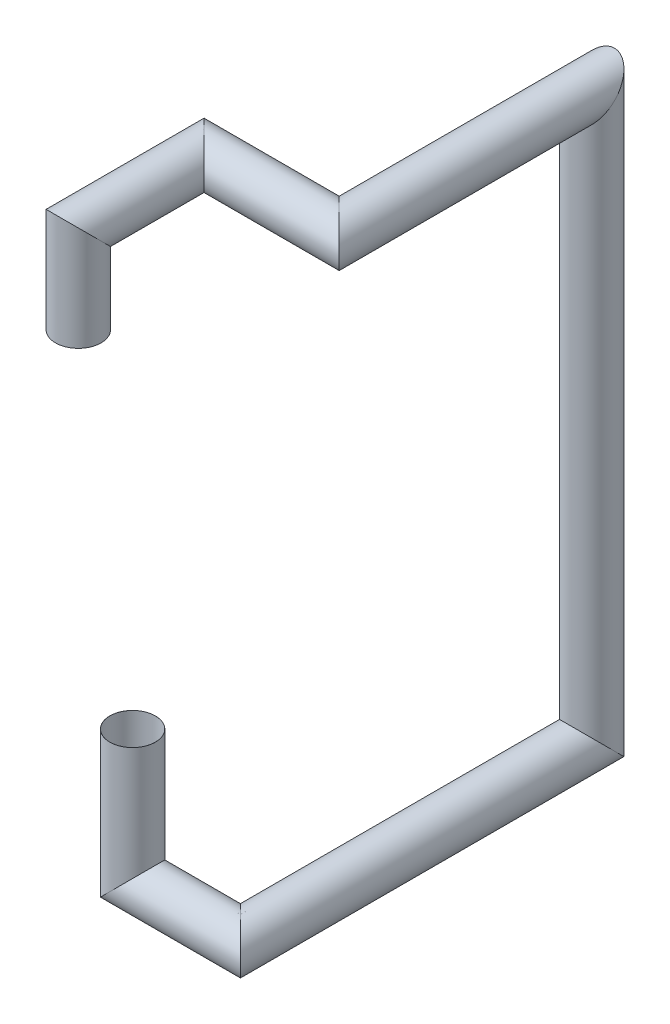
ISO-10303-21;
HEADER;
FILE_DESCRIPTION(('STEP AP214'),'2;1');
FILE_NAME('part.step','',(''),(''),'','','');
FILE_SCHEMA(('AUTOMOTIVE_DESIGN { 1 0 10303 214 1 1 1 1 }'));
ENDSEC;
DATA;
#1=APPLICATION_CONTEXT('core data for automotive mechanical design processes');
#2=APPLICATION_PROTOCOL_DEFINITION('international standard','automotive_design',2000,#1);
#3=PRODUCT_CONTEXT('',#1,'mechanical');
#4=PRODUCT('Part','Part','',(#3));
#5=PRODUCT_RELATED_PRODUCT_CATEGORY('part','',(#4));
#6=PRODUCT_DEFINITION_FORMATION('','',#4);
#7=PRODUCT_DEFINITION_CONTEXT('part definition',#1,'design');
#8=PRODUCT_DEFINITION('design','',#6,#7);
#9=PRODUCT_DEFINITION_SHAPE('','',#8);
#10=(LENGTH_UNIT() NAMED_UNIT(*) SI_UNIT(.MILLI.,.METRE.));
#11=(NAMED_UNIT(*) PLANE_ANGLE_UNIT() SI_UNIT($,.RADIAN.));
#12=(NAMED_UNIT(*) SI_UNIT($,.STERADIAN.) SOLID_ANGLE_UNIT());
#13=UNCERTAINTY_MEASURE_WITH_UNIT(LENGTH_MEASURE(1.E-05),#10,'distance_accuracy_value','');
#14=(GEOMETRIC_REPRESENTATION_CONTEXT(3) GLOBAL_UNCERTAINTY_ASSIGNED_CONTEXT((#13)) GLOBAL_UNIT_ASSIGNED_CONTEXT((#10,
#11,#12)) REPRESENTATION_CONTEXT('',''));
#15=CARTESIAN_POINT('',(0.,0.,0.));
#16=DIRECTION('',(0.,0.,1.));
#17=DIRECTION('',(1.,0.,0.));
#18=AXIS2_PLACEMENT_3D('',#15,#16,#17);
#19=CARTESIAN_POINT('',(5.99221023886543,-75.8194831276882,-5.92067605487046));
#20=DIRECTION('',(0.,-1.,0.));
#21=DIRECTION('',(0.,0.,-1.));
#22=AXIS2_PLACEMENT_3D('',#19,#20,#21);
#23=PLANE('',#22);
#24=CARTESIAN_POINT('',(5.99221023886543,-75.8194831276882,-5.92067605487046));
#25=DIRECTION('',(0.,-1.,0.));
#26=DIRECTION('',(0.,0.,-1.));
#27=AXIS2_PLACEMENT_3D('',#24,#25,#26);
#28=CIRCLE('',#27,4.99);
#29=CARTESIAN_POINT('',(5.99221023886543,-75.8194831276882,-10.9106760548705));
#30=VERTEX_POINT('',#29);
#31=EDGE_CURVE('E87',#30,#30,#28,.T.);
#32=ORIENTED_EDGE('',*,*,#31,.T.);
#33=EDGE_LOOP('',(#32));
#34=FACE_BOUND('',#33,.T.);
#35=CARTESIAN_POINT('',(5.99221023886543,-75.8194831276882,-5.92067605487046));
#36=DIRECTION('',(0.,-1.,0.));
#37=DIRECTION('',(0.,0.,-1.));
#38=AXIS2_PLACEMENT_3D('',#35,#36,#37);
#39=CIRCLE('',#38,5.);
#40=CARTESIAN_POINT('',(5.99221023886543,-75.8194831276882,-10.9206760548705));
#41=VERTEX_POINT('',#40);
#42=EDGE_CURVE('E50',#41,#41,#39,.T.);
#43=ORIENTED_EDGE('',*,*,#42,.F.);
#44=EDGE_LOOP('',(#43));
#45=FACE_BOUND('',#44,.T.);
#46=ADVANCED_FACE('F47',(#34,#45),#23,.F.);
#47=CARTESIAN_POINT('',(0.,0.,0.));
#48=DIRECTION('',(0.,-1.,0.));
#49=DIRECTION('',(-1.,0.,0.));
#50=AXIS2_PLACEMENT_3D('',#47,#48,#49);
#51=PLANE('',#50);
#52=CARTESIAN_POINT('',(0.,0.,0.));
#53=DIRECTION('',(0.,-1.,0.));
#54=DIRECTION('',(0.,0.,-1.));
#55=AXIS2_PLACEMENT_3D('',#52,#53,#54);
#56=CIRCLE('',#55,4.99);
#57=CARTESIAN_POINT('',(0.,0.,-4.99));
#58=VERTEX_POINT('',#57);
#59=EDGE_CURVE('E100',#58,#58,#56,.T.);
#60=ORIENTED_EDGE('',*,*,#59,.F.);
#61=EDGE_LOOP('',(#60));
#62=FACE_BOUND('',#61,.T.);
#63=CARTESIAN_POINT('',(0.,0.,0.));
#64=DIRECTION('',(0.,-1.,0.));
#65=DIRECTION('',(-1.,0.,0.));
#66=AXIS2_PLACEMENT_3D('',#63,#64,#65);
#67=CIRCLE('',#66,5.);
#68=CARTESIAN_POINT('',(-5.00000000000001,0.,0.));
#69=VERTEX_POINT('',#68);
#70=EDGE_CURVE('E55',#69,#69,#67,.T.);
#71=ORIENTED_EDGE('',*,*,#70,.T.);
#72=EDGE_LOOP('',(#71));
#73=FACE_BOUND('',#72,.T.);
#74=ADVANCED_FACE('F130',(#62,#73),#51,.T.);
#75=CARTESIAN_POINT('',(5.99221023886543,-115.326715377706,-5.92067605487046));
#76=DIRECTION('',(0.,1.,0.));
#77=DIRECTION('',(0.,0.,1.));
#78=AXIS2_PLACEMENT_3D('',#75,#76,#77);
#79=CYLINDRICAL_SURFACE('',#78,5.);
#80=CARTESIAN_POINT('',(5.99221023886544,-104.226715377706,-5.92067605487046));
#81=DIRECTION('',(-0.707106781186548,0.707106781186548,0.));
#82=DIRECTION('',(-0.707106781186548,-0.707106781186548,0.));
#83=AXIS2_PLACEMENT_3D('',#80,#81,#82);
#84=ELLIPSE('',#83,7.07106781186547,5.);
#85=CARTESIAN_POINT('',(0.992210238865442,-109.226715377706,-5.92067605487046));
#86=VERTEX_POINT('',#85);
#87=EDGE_CURVE('E120',#86,#86,#84,.T.);
#88=ORIENTED_EDGE('',*,*,#87,.T.);
#89=EDGE_LOOP('',(#88));
#90=FACE_BOUND('',#89,.T.);
#91=ORIENTED_EDGE('',*,*,#42,.T.);
#92=EDGE_LOOP('',(#91));
#93=FACE_BOUND('',#92,.T.);
#94=ADVANCED_FACE('F127',(#90,#93),#79,.T.);
#95=CARTESIAN_POINT('',(35.2526168741522,-104.226715377706,-5.92067605487046));
#96=DIRECTION('',(-1.,0.,0.));
#97=DIRECTION('',(0.,0.,1.));
#98=AXIS2_PLACEMENT_3D('',#95,#96,#97);
#99=CYLINDRICAL_SURFACE('',#98,5.);
#100=CARTESIAN_POINT('',(29.6526168741522,-104.226715377706,-5.92067605487046));
#101=DIRECTION('',(-0.707106781186547,0.,0.707106781186547));
#102=DIRECTION('',(0.707106781186548,0.,0.707106781186548));
#103=AXIS2_PLACEMENT_3D('',#100,#101,#102);
#104=ELLIPSE('',#103,7.07106781186548,5.);
#105=CARTESIAN_POINT('',(34.6526168741522,-104.226715377706,-0.920676054870454));
#106=VERTEX_POINT('',#105);
#107=EDGE_CURVE('E118',#106,#106,#104,.T.);
#108=ORIENTED_EDGE('',*,*,#107,.T.);
#109=EDGE_LOOP('',(#108));
#110=FACE_BOUND('',#109,.T.);
#111=ORIENTED_EDGE('',*,*,#87,.F.);
#112=EDGE_LOOP('',(#111));
#113=FACE_BOUND('',#112,.T.);
#114=ADVANCED_FACE('F174',(#110,#113),#99,.T.);
#115=CARTESIAN_POINT('',(29.6526168741522,-104.226715377706,-94.0820727591368));
#116=DIRECTION('',(0.,0.,1.));
#117=DIRECTION('',(1.,0.,0.));
#118=AXIS2_PLACEMENT_3D('',#115,#116,#117);
#119=CYLINDRICAL_SURFACE('',#118,5.);
#120=CARTESIAN_POINT('',(29.6526168741522,-104.226715377706,-82.9820727591368));
#121=DIRECTION('',(0.,-0.707106781186548,0.707106781186547));
#122=DIRECTION('',(0.,-0.707106781186547,-0.707106781186548));
#123=AXIS2_PLACEMENT_3D('',#120,#121,#122);
#124=ELLIPSE('',#123,7.07106781186548,5.);
#125=CARTESIAN_POINT('',(29.6526168741522,-109.226715377706,-87.9820727591368));
#126=VERTEX_POINT('',#125);
#127=EDGE_CURVE('E115',#126,#126,#124,.T.);
#128=ORIENTED_EDGE('',*,*,#127,.T.);
#129=EDGE_LOOP('',(#128));
#130=FACE_BOUND('',#129,.T.);
#131=ORIENTED_EDGE('',*,*,#107,.F.);
#132=EDGE_LOOP('',(#131));
#133=FACE_BOUND('',#132,.T.);
#134=ADVANCED_FACE('F170',(#130,#133),#119,.T.);
#135=CARTESIAN_POINT('',(29.6526168741522,30.4485751253153,-82.9820727591368));
#136=DIRECTION('',(0.,-1.,0.));
#137=DIRECTION('',(0.,0.,-1.));
#138=AXIS2_PLACEMENT_3D('',#135,#136,#137);
#139=CYLINDRICAL_SURFACE('',#138,5.);
#140=CARTESIAN_POINT('',(29.6526168741522,19.3485751253153,-82.9820727591368));
#141=DIRECTION('',(0.,-0.707106781186547,-0.707106781186548));
#142=DIRECTION('',(0.,0.707106781186548,-0.707106781186547));
#143=AXIS2_PLACEMENT_3D('',#140,#141,#142);
#144=ELLIPSE('',#143,7.07106781186548,5.);
#145=CARTESIAN_POINT('',(29.6526168741522,24.3485751253153,-87.9820727591368));
#146=VERTEX_POINT('',#145);
#147=EDGE_CURVE('E112',#146,#146,#144,.T.);
#148=ORIENTED_EDGE('',*,*,#147,.T.);
#149=EDGE_LOOP('',(#148));
#150=FACE_BOUND('',#149,.T.);
#151=ORIENTED_EDGE('',*,*,#127,.F.);
#152=EDGE_LOOP('',(#151));
#153=FACE_BOUND('',#152,.T.);
#154=ADVANCED_FACE('F166',(#150,#153),#139,.T.);
#155=CARTESIAN_POINT('',(29.6526168741522,19.3485751253153,-21.9872811902644));
#156=DIRECTION('',(0.,0.,-1.));
#157=DIRECTION('',(0.,1.,0.));
#158=AXIS2_PLACEMENT_3D('',#155,#156,#157);
#159=CYLINDRICAL_SURFACE('',#158,5.);
#160=CARTESIAN_POINT('',(29.6526168741522,19.3485751253153,-27.5872811902644));
#161=DIRECTION('',(0.707106781186548,0.,-0.707106781186548));
#162=DIRECTION('',(0.707106781186548,0.,0.707106781186548));
#163=AXIS2_PLACEMENT_3D('',#160,#161,#162);
#164=ELLIPSE('',#163,7.07106781186547,5.);
#165=CARTESIAN_POINT('',(34.6526168741522,19.3485751253153,-22.5872811902644));
#166=VERTEX_POINT('',#165);
#167=EDGE_CURVE('E109',#166,#166,#164,.T.);
#168=ORIENTED_EDGE('',*,*,#167,.T.);
#169=EDGE_LOOP('',(#168));
#170=FACE_BOUND('',#169,.T.);
#171=ORIENTED_EDGE('',*,*,#147,.F.);
#172=EDGE_LOOP('',(#171));
#173=FACE_BOUND('',#172,.T.);
#174=ADVANCED_FACE('F162',(#170,#173),#159,.T.);
#175=CARTESIAN_POINT('',(-5.59999999999999,19.3485751253153,-27.5872811902644));
#176=DIRECTION('',(1.,0.,0.));
#177=DIRECTION('',(0.,0.,-1.));
#178=AXIS2_PLACEMENT_3D('',#175,#176,#177);
#179=CYLINDRICAL_SURFACE('',#178,5.);
#180=CARTESIAN_POINT('',(0.,19.3485751253153,-27.5872811902644));
#181=DIRECTION('',(0.707106781186548,0.,-0.707106781186548));
#182=DIRECTION('',(-0.707106781186548,0.,-0.707106781186548));
#183=AXIS2_PLACEMENT_3D('',#180,#181,#182);
#184=ELLIPSE('',#183,7.07106781186547,5.);
#185=CARTESIAN_POINT('',(-5.00000000000001,19.3485751253153,-32.5872811902644));
#186=VERTEX_POINT('',#185);
#187=EDGE_CURVE('E105',#186,#186,#184,.T.);
#188=ORIENTED_EDGE('',*,*,#187,.T.);
#189=EDGE_LOOP('',(#188));
#190=FACE_BOUND('',#189,.T.);
#191=ORIENTED_EDGE('',*,*,#167,.F.);
#192=EDGE_LOOP('',(#191));
#193=FACE_BOUND('',#192,.T.);
#194=ADVANCED_FACE('F153',(#190,#193),#179,.T.);
#195=CARTESIAN_POINT('',(0.,19.3485751253153,11.1));
#196=DIRECTION('',(0.,0.,-1.));
#197=DIRECTION('',(-1.,0.,0.));
#198=AXIS2_PLACEMENT_3D('',#195,#196,#197);
#199=CYLINDRICAL_SURFACE('',#198,5.);
#200=CARTESIAN_POINT('',(0.,19.3485751253153,0.));
#201=DIRECTION('',(0.,0.707106781186548,-0.707106781186548));
#202=DIRECTION('',(0.,0.707106781186548,0.707106781186548));
#203=AXIS2_PLACEMENT_3D('',#200,#201,#202);
#204=ELLIPSE('',#203,7.07106781186547,5.);
#205=CARTESIAN_POINT('',(0.,24.3485751253153,5.));
#206=VERTEX_POINT('',#205);
#207=EDGE_CURVE('E12',#206,#206,#204,.T.);
#208=ORIENTED_EDGE('',*,*,#207,.T.);
#209=EDGE_LOOP('',(#208));
#210=FACE_BOUND('',#209,.T.);
#211=ORIENTED_EDGE('',*,*,#187,.F.);
#212=EDGE_LOOP('',(#211));
#213=FACE_BOUND('',#212,.T.);
#214=ADVANCED_FACE('F145',(#210,#213),#199,.T.);
#215=CARTESIAN_POINT('',(0.,0.,0.));
#216=DIRECTION('',(0.,1.,0.));
#217=DIRECTION('',(0.,0.,1.));
#218=AXIS2_PLACEMENT_3D('',#215,#216,#217);
#219=CYLINDRICAL_SURFACE('',#218,5.);
#220=ORIENTED_EDGE('',*,*,#70,.F.);
#221=EDGE_LOOP('',(#220));
#222=FACE_BOUND('',#221,.T.);
#223=ORIENTED_EDGE('',*,*,#207,.F.);
#224=EDGE_LOOP('',(#223));
#225=FACE_BOUND('',#224,.T.);
#226=ADVANCED_FACE('F142',(#222,#225),#219,.T.);
#227=CARTESIAN_POINT('',(5.99221023886543,-115.326715377706,-5.92067605487046));
#228=DIRECTION('',(0.,1.,0.));
#229=DIRECTION('',(0.,0.,1.));
#230=AXIS2_PLACEMENT_3D('',#227,#228,#229);
#231=CYLINDRICAL_SURFACE('',#230,4.99);
#232=CARTESIAN_POINT('',(5.99221023886543,-104.226715377706,-5.92067605487046));
#233=DIRECTION('',(-0.707106781186547,0.707106781186547,0.));
#234=DIRECTION('',(0.707106781186547,0.707106781186547,0.));
#235=AXIS2_PLACEMENT_3D('',#232,#233,#234);
#236=ELLIPSE('',#235,7.05692567624174,4.99);
#237=CARTESIAN_POINT('',(5.99221023886543,-104.226715377706,-0.930676054870455));
#238=VERTEX_POINT('',#237);
#239=EDGE_CURVE('E83',#238,#238,#236,.T.);
#240=ORIENTED_EDGE('',*,*,#239,.F.);
#241=EDGE_LOOP('',(#240));
#242=FACE_BOUND('',#241,.T.);
#243=ORIENTED_EDGE('',*,*,#31,.F.);
#244=EDGE_LOOP('',(#243));
#245=FACE_BOUND('',#244,.T.);
#246=ADVANCED_FACE('F144',(#242,#245),#231,.F.);
#247=CARTESIAN_POINT('',(35.2526168741522,-104.226715377706,-5.92067605487046));
#248=DIRECTION('',(-1.,0.,0.));
#249=DIRECTION('',(0.,0.,1.));
#250=AXIS2_PLACEMENT_3D('',#247,#248,#249);
#251=CYLINDRICAL_SURFACE('',#250,4.99);
#252=CARTESIAN_POINT('',(29.6526168741522,-104.226715377706,-5.92067605487046));
#253=DIRECTION('',(-0.707106781186547,0.,0.707106781186547));
#254=DIRECTION('',(-0.707106781186547,0.,-0.707106781186547));
#255=AXIS2_PLACEMENT_3D('',#252,#253,#254);
#256=ELLIPSE('',#255,7.05692567624174,4.99);
#257=CARTESIAN_POINT('',(29.6526168741522,-99.2367153777061,-5.92067605487046));
#258=VERTEX_POINT('',#257);
#259=EDGE_CURVE('E86',#258,#258,#256,.T.);
#260=ORIENTED_EDGE('',*,*,#259,.F.);
#261=EDGE_LOOP('',(#260));
#262=FACE_BOUND('',#261,.T.);
#263=ORIENTED_EDGE('',*,*,#239,.T.);
#264=EDGE_LOOP('',(#263));
#265=FACE_BOUND('',#264,.T.);
#266=ADVANCED_FACE('F84',(#262,#265),#251,.F.);
#267=CARTESIAN_POINT('',(29.6526168741522,-104.226715377706,-94.0820727591368));
#268=DIRECTION('',(0.,0.,1.));
#269=DIRECTION('',(1.,0.,0.));
#270=AXIS2_PLACEMENT_3D('',#267,#268,#269);
#271=CYLINDRICAL_SURFACE('',#270,4.99);
#272=CARTESIAN_POINT('',(29.6526168741522,-104.226715377706,-82.9820727591368));
#273=DIRECTION('',(0.,-0.707106781186548,0.707106781186547));
#274=DIRECTION('',(0.,0.707106781186547,0.707106781186548));
#275=AXIS2_PLACEMENT_3D('',#272,#273,#274);
#276=ELLIPSE('',#275,7.05692567624174,4.99);
#277=CARTESIAN_POINT('',(34.6426168741522,-104.226715377706,-82.9820727591368));
#278=VERTEX_POINT('',#277);
#279=EDGE_CURVE('E89',#278,#278,#276,.T.);
#280=ORIENTED_EDGE('',*,*,#279,.F.);
#281=EDGE_LOOP('',(#280));
#282=FACE_BOUND('',#281,.T.);
#283=ORIENTED_EDGE('',*,*,#259,.T.);
#284=EDGE_LOOP('',(#283));
#285=FACE_BOUND('',#284,.T.);
#286=ADVANCED_FACE('F217',(#282,#285),#271,.F.);
#287=CARTESIAN_POINT('',(29.6526168741522,30.4485751253153,-82.9820727591368));
#288=DIRECTION('',(0.,-1.,0.));
#289=DIRECTION('',(0.,0.,-1.));
#290=AXIS2_PLACEMENT_3D('',#287,#288,#289);
#291=CYLINDRICAL_SURFACE('',#290,4.99);
#292=CARTESIAN_POINT('',(29.6526168741522,19.3485751253153,-82.9820727591368));
#293=DIRECTION('',(0.,-0.707106781186547,-0.707106781186548));
#294=DIRECTION('',(0.,-0.707106781186548,0.707106781186547));
#295=AXIS2_PLACEMENT_3D('',#292,#293,#294);
#296=ELLIPSE('',#295,7.05692567624174,4.99);
#297=CARTESIAN_POINT('',(34.6426168741522,19.3485751253153,-82.9820727591368));
#298=VERTEX_POINT('',#297);
#299=EDGE_CURVE('E95',#298,#298,#296,.T.);
#300=ORIENTED_EDGE('',*,*,#299,.F.);
#301=EDGE_LOOP('',(#300));
#302=FACE_BOUND('',#301,.T.);
#303=ORIENTED_EDGE('',*,*,#279,.T.);
#304=EDGE_LOOP('',(#303));
#305=FACE_BOUND('',#304,.T.);
#306=ADVANCED_FACE('F209',(#302,#305),#291,.F.);
#307=CARTESIAN_POINT('',(29.6526168741522,19.3485751253153,-21.9872811902644));
#308=DIRECTION('',(0.,0.,-1.));
#309=DIRECTION('',(0.,1.,0.));
#310=AXIS2_PLACEMENT_3D('',#307,#308,#309);
#311=CYLINDRICAL_SURFACE('',#310,4.99);
#312=CARTESIAN_POINT('',(29.6526168741522,19.3485751253153,-27.5872811902644));
#313=DIRECTION('',(0.707106781186547,0.,-0.707106781186547));
#314=DIRECTION('',(-0.707106781186547,0.,-0.707106781186547));
#315=AXIS2_PLACEMENT_3D('',#312,#313,#314);
#316=ELLIPSE('',#315,7.05692567624174,4.99);
#317=CARTESIAN_POINT('',(29.6526168741522,14.3585751253153,-27.5872811902644));
#318=VERTEX_POINT('',#317);
#319=EDGE_CURVE('E97',#318,#318,#316,.T.);
#320=ORIENTED_EDGE('',*,*,#319,.F.);
#321=EDGE_LOOP('',(#320));
#322=FACE_BOUND('',#321,.T.);
#323=ORIENTED_EDGE('',*,*,#299,.T.);
#324=EDGE_LOOP('',(#323));
#325=FACE_BOUND('',#324,.T.);
#326=ADVANCED_FACE('F201',(#322,#325),#311,.F.);
#327=CARTESIAN_POINT('',(-5.59999999999999,19.3485751253153,-27.5872811902644));
#328=DIRECTION('',(1.,0.,0.));
#329=DIRECTION('',(0.,0.,-1.));
#330=AXIS2_PLACEMENT_3D('',#327,#328,#329);
#331=CYLINDRICAL_SURFACE('',#330,4.99);
#332=CARTESIAN_POINT('',(0.,19.3485751253153,-27.5872811902644));
#333=DIRECTION('',(0.707106781186547,0.,-0.707106781186547));
#334=DIRECTION('',(0.707106781186547,0.,0.707106781186547));
#335=AXIS2_PLACEMENT_3D('',#332,#333,#334);
#336=ELLIPSE('',#335,7.05692567624174,4.99);
#337=CARTESIAN_POINT('',(0.,24.3385751253153,-27.5872811902644));
#338=VERTEX_POINT('',#337);
#339=EDGE_CURVE('E66',#338,#338,#336,.T.);
#340=ORIENTED_EDGE('',*,*,#339,.F.);
#341=EDGE_LOOP('',(#340));
#342=FACE_BOUND('',#341,.T.);
#343=ORIENTED_EDGE('',*,*,#319,.T.);
#344=EDGE_LOOP('',(#343));
#345=FACE_BOUND('',#344,.T.);
#346=ADVANCED_FACE('F194',(#342,#345),#331,.F.);
#347=CARTESIAN_POINT('',(0.,19.3485751253153,11.1));
#348=DIRECTION('',(0.,0.,-1.));
#349=DIRECTION('',(-1.,0.,0.));
#350=AXIS2_PLACEMENT_3D('',#347,#348,#349);
#351=CYLINDRICAL_SURFACE('',#350,4.99);
#352=CARTESIAN_POINT('',(0.,19.3485751253153,0.));
#353=DIRECTION('',(0.,0.707106781186547,-0.707106781186547));
#354=DIRECTION('',(0.,-0.707106781186547,-0.707106781186547));
#355=AXIS2_PLACEMENT_3D('',#352,#353,#354);
#356=ELLIPSE('',#355,7.05692567624174,4.99);
#357=CARTESIAN_POINT('',(4.98999999999999,19.3485751253153,0.));
#358=VERTEX_POINT('',#357);
#359=EDGE_CURVE('E61',#358,#358,#356,.T.);
#360=ORIENTED_EDGE('',*,*,#359,.F.);
#361=EDGE_LOOP('',(#360));
#362=FACE_BOUND('',#361,.T.);
#363=ORIENTED_EDGE('',*,*,#339,.T.);
#364=EDGE_LOOP('',(#363));
#365=FACE_BOUND('',#364,.T.);
#366=ADVANCED_FACE('F139',(#362,#365),#351,.F.);
#367=CARTESIAN_POINT('',(0.,0.,0.));
#368=DIRECTION('',(0.,1.,0.));
#369=DIRECTION('',(0.,0.,1.));
#370=AXIS2_PLACEMENT_3D('',#367,#368,#369);
#371=CYLINDRICAL_SURFACE('',#370,4.99);
#372=ORIENTED_EDGE('',*,*,#59,.T.);
#373=EDGE_LOOP('',(#372));
#374=FACE_BOUND('',#373,.T.);
#375=ORIENTED_EDGE('',*,*,#359,.T.);
#376=EDGE_LOOP('',(#375));
#377=FACE_BOUND('',#376,.T.);
#378=ADVANCED_FACE('F132',(#374,#377),#371,.F.);
#379=CLOSED_SHELL('',(#46,#74,#94,#114,#134,#154,#174,#194,#214,#226,#246,#266,#286,#306,#326,
#346,#366,#378));
#380=MANIFOLD_SOLID_BREP('B2',#379);
#381=ADVANCED_BREP_SHAPE_REPRESENTATION('',(#18,#380),#14);
#382=SHAPE_DEFINITION_REPRESENTATION(#9,#381);
ENDSEC;
END-ISO-10303-21;
